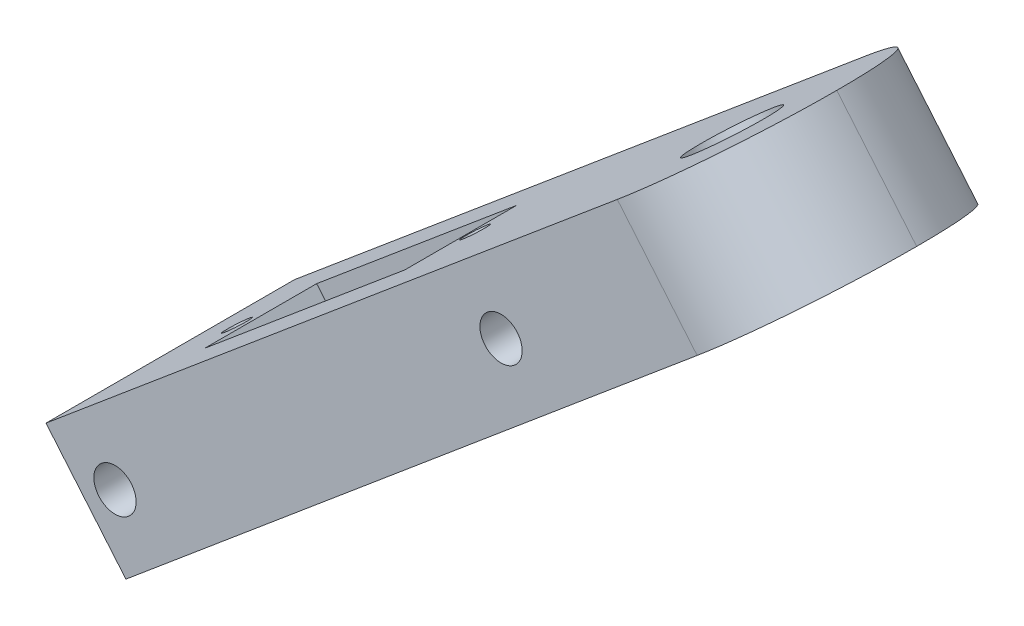
ISO-10303-21;
HEADER;
FILE_DESCRIPTION(('STEP AP214'),'2;1');
FILE_NAME('part.step','',(''),(''),'','','');
FILE_SCHEMA(('AUTOMOTIVE_DESIGN { 1 0 10303 214 1 1 1 1 }'));
ENDSEC;
DATA;
#1=APPLICATION_CONTEXT('core data for automotive mechanical design processes');
#2=APPLICATION_PROTOCOL_DEFINITION('international standard','automotive_design',2000,#1);
#3=PRODUCT_CONTEXT('',#1,'mechanical');
#4=PRODUCT('Part','Part','',(#3));
#5=PRODUCT_RELATED_PRODUCT_CATEGORY('part','',(#4));
#6=PRODUCT_DEFINITION_FORMATION('','',#4);
#7=PRODUCT_DEFINITION_CONTEXT('part definition',#1,'design');
#8=PRODUCT_DEFINITION('design','',#6,#7);
#9=PRODUCT_DEFINITION_SHAPE('','',#8);
#10=(LENGTH_UNIT() NAMED_UNIT(*) SI_UNIT(.MILLI.,.METRE.));
#11=(NAMED_UNIT(*) PLANE_ANGLE_UNIT() SI_UNIT($,.RADIAN.));
#12=(NAMED_UNIT(*) SI_UNIT($,.STERADIAN.) SOLID_ANGLE_UNIT());
#13=UNCERTAINTY_MEASURE_WITH_UNIT(LENGTH_MEASURE(1.E-05),#10,'distance_accuracy_value','');
#14=(GEOMETRIC_REPRESENTATION_CONTEXT(3) GLOBAL_UNCERTAINTY_ASSIGNED_CONTEXT((#13)) GLOBAL_UNIT_ASSIGNED_CONTEXT((#10,
#11,#12)) REPRESENTATION_CONTEXT('',''));
#15=CARTESIAN_POINT('',(0.,0.,0.));
#16=DIRECTION('',(0.,0.,1.));
#17=DIRECTION('',(1.,0.,0.));
#18=AXIS2_PLACEMENT_3D('',#15,#16,#17);
#19=CARTESIAN_POINT('',(-6.4278760968654,7.66044443118977,0.));
#20=DIRECTION('',(-0.64278760968654,0.766044443118977,0.));
#21=DIRECTION('',(-0.766044443118977,-0.64278760968654,0.));
#22=AXIS2_PLACEMENT_3D('',#19,#20,#21);
#23=PLANE('',#22);
#24=CARTESIAN_POINT('',(23.4478571847747,32.7291612089649,0.));
#25=DIRECTION('',(-0.64278760968654,0.766044443118977,0.));
#26=DIRECTION('',(-0.766044443118977,-0.642787609686541,0.));
#27=AXIS2_PLACEMENT_3D('',#24,#25,#26);
#28=CIRCLE('',#27,3.29999999999999);
#29=CARTESIAN_POINT('',(20.9199105224821,30.6079620969993,0.));
#30=VERTEX_POINT('',#29);
#31=EDGE_CURVE('E209',#30,#30,#28,.T.);
#32=ORIENTED_EDGE('',*,*,#31,.F.);
#33=EDGE_LOOP('',(#32));
#34=FACE_BOUND('',#33,.T.);
#35=CARTESIAN_POINT('',(-16.3864538574121,-0.695794494735249,0.));
#36=DIRECTION('',(-0.64278760968654,0.766044443118977,0.));
#37=DIRECTION('',(-0.766044443118977,-0.642787609686541,0.));
#38=AXIS2_PLACEMENT_3D('',#35,#36,#37);
#39=CIRCLE('',#38,0.999999999999998);
#40=CARTESIAN_POINT('',(-17.1524983005311,-1.33858210442179,0.));
#41=VERTEX_POINT('',#40);
#42=EDGE_CURVE('E215',#41,#41,#39,.T.);
#43=ORIENTED_EDGE('',*,*,#42,.F.);
#44=EDGE_LOOP('',(#43));
#45=FACE_BOUND('',#44,.T.);
#46=CARTESIAN_POINT('',(2.76465722056232,15.3738957474283,0.));
#47=DIRECTION('',(-0.64278760968654,0.766044443118977,0.));
#48=DIRECTION('',(-0.766044443118977,-0.642787609686541,0.));
#49=AXIS2_PLACEMENT_3D('',#46,#47,#48);
#50=CIRCLE('',#49,1.);
#51=CARTESIAN_POINT('',(1.99861277744334,14.7311081377417,0.));
#52=VERTEX_POINT('',#51);
#53=EDGE_CURVE('E221',#52,#52,#50,.T.);
#54=ORIENTED_EDGE('',*,*,#53,.F.);
#55=EDGE_LOOP('',(#54));
#56=FACE_BOUND('',#55,.T.);
#57=CARTESIAN_POINT('',(24.2139016278937,33.3719488186514,0.));
#58=DIRECTION('',(-0.64278760968654,0.766044443118977,0.));
#59=DIRECTION('',(-0.766044443118977,-0.64278760968654,0.));
#60=AXIS2_PLACEMENT_3D('',#57,#58,#59);
#61=CIRCLE('',#60,10.);
#62=CARTESIAN_POINT('',(24.2139016278937,33.3719488186514,10.));
#63=VERTEX_POINT('',#62);
#64=CARTESIAN_POINT('',(31.8743460590835,39.7998249155168,0.));
#65=VERTEX_POINT('',#64);
#66=EDGE_CURVE('E53',#63,#65,#61,.T.);
#67=ORIENTED_EDGE('',*,*,#66,.T.);
#68=CARTESIAN_POINT('',(24.2139016278937,33.3719488186514,0.));
#69=DIRECTION('',(-0.64278760968654,0.766044443118977,0.));
#70=DIRECTION('',(-0.766044443118977,-0.64278760968654,0.));
#71=AXIS2_PLACEMENT_3D('',#68,#69,#70);
#72=CIRCLE('',#71,10.);
#73=CARTESIAN_POINT('',(24.2139016278937,33.3719488186514,-10.));
#74=VERTEX_POINT('',#73);
#75=EDGE_CURVE('E46',#65,#74,#72,.T.);
#76=ORIENTED_EDGE('',*,*,#75,.T.);
#77=DIRECTION('',(-0.766044443118977,-0.64278760968654,0.));
#78=VECTOR('',#77,1.);
#79=CARTESIAN_POINT('',(-21.7487649592449,-5.19530776254104,-10.));
#80=LINE('',#79,#78);
#81=CARTESIAN_POINT('',(-21.7487649592449,-5.19530776254104,-10.));
#82=VERTEX_POINT('',#81);
#83=EDGE_CURVE('E158',#74,#82,#80,.T.);
#84=ORIENTED_EDGE('',*,*,#83,.T.);
#85=DIRECTION('',(0.,0.,1.));
#86=VECTOR('',#85,1.);
#87=CARTESIAN_POINT('',(-21.7487649592449,-5.19530776254104,-10.));
#88=LINE('',#87,#86);
#89=CARTESIAN_POINT('',(-21.7487649592449,-5.19530776254103,10.));
#90=VERTEX_POINT('',#89);
#91=EDGE_CURVE('E152',#82,#90,#88,.T.);
#92=ORIENTED_EDGE('',*,*,#91,.T.);
#93=DIRECTION('',(0.766044443118977,0.64278760968654,0.));
#94=VECTOR('',#93,1.);
#95=CARTESIAN_POINT('',(-21.7487649592449,-5.19530776254103,10.));
#96=LINE('',#95,#94);
#97=EDGE_CURVE('E155',#90,#63,#96,.T.);
#98=ORIENTED_EDGE('',*,*,#97,.T.);
#99=EDGE_LOOP('',(#67,#76,#84,#92,#98));
#100=FACE_BOUND('',#99,.T.);
#101=DIRECTION('',(0.766044443118977,0.642787609686541,0.));
#102=VECTOR('',#101,1.);
#103=CARTESIAN_POINT('',(1.61559055588379,14.4097143328984,4.49999999999997));
#104=LINE('',#103,#102);
#105=CARTESIAN_POINT('',(-14.4713427496147,0.911174529481098,4.49999999999997));
#106=VERTEX_POINT('',#105);
#107=CARTESIAN_POINT('',(1.61559055588379,14.4097143328984,4.49999999999997));
#108=VERTEX_POINT('',#107);
#109=EDGE_CURVE('E119',#106,#108,#104,.T.);
#110=ORIENTED_EDGE('',*,*,#109,.F.);
#111=DIRECTION('',(0.,0.,1.));
#112=VECTOR('',#111,1.);
#113=CARTESIAN_POINT('',(-14.4713427496147,0.911174529481098,-4.5));
#114=LINE('',#113,#112);
#115=CARTESIAN_POINT('',(-14.4713427496147,0.911174529481098,-4.5));
#116=VERTEX_POINT('',#115);
#117=EDGE_CURVE('E109',#116,#106,#114,.T.);
#118=ORIENTED_EDGE('',*,*,#117,.F.);
#119=DIRECTION('',(-0.766044443118977,-0.642787609686541,0.));
#120=VECTOR('',#119,1.);
#121=CARTESIAN_POINT('',(1.61559055588379,14.4097143328984,-4.5));
#122=LINE('',#121,#120);
#123=CARTESIAN_POINT('',(1.61559055588379,14.4097143328984,-4.5));
#124=VERTEX_POINT('',#123);
#125=EDGE_CURVE('E134',#124,#116,#122,.T.);
#126=ORIENTED_EDGE('',*,*,#125,.F.);
#127=DIRECTION('',(0.,0.,-1.));
#128=VECTOR('',#127,1.);
#129=CARTESIAN_POINT('',(1.61559055588379,14.4097143328984,-4.5));
#130=LINE('',#129,#128);
#131=EDGE_CURVE('E132',#108,#124,#130,.T.);
#132=ORIENTED_EDGE('',*,*,#131,.F.);
#133=EDGE_LOOP('',(#110,#118,#126,#132));
#134=FACE_BOUND('',#133,.T.);
#135=ADVANCED_FACE('F37',(#34,#45,#56,#100,#134),#23,.T.);
#136=CARTESIAN_POINT('',(0.,0.,0.));
#137=DIRECTION('',(-0.64278760968654,0.766044443118977,0.));
#138=DIRECTION('',(-0.766044443118977,-0.64278760968654,0.));
#139=AXIS2_PLACEMENT_3D('',#136,#137,#138);
#140=PLANE('',#139);
#141=CARTESIAN_POINT('',(29.8757332816401,25.0687167777751,0.));
#142=DIRECTION('',(-0.64278760968654,0.766044443118977,0.));
#143=DIRECTION('',(-0.766044443118977,-0.64278760968654,0.));
#144=AXIS2_PLACEMENT_3D('',#141,#142,#143);
#145=CIRCLE('',#144,3.29999999999999);
#146=CARTESIAN_POINT('',(27.3477866193475,22.9475176658095,0.));
#147=VERTEX_POINT('',#146);
#148=EDGE_CURVE('E141',#147,#147,#145,.F.);
#149=ORIENTED_EDGE('',*,*,#148,.F.);
#150=EDGE_LOOP('',(#149));
#151=FACE_BOUND('',#150,.T.);
#152=CARTESIAN_POINT('',(-9.9585777605467,-8.35623892592503,0.));
#153=DIRECTION('',(-0.64278760968654,0.766044443118977,0.));
#154=DIRECTION('',(-0.766044443118977,-0.64278760968654,0.));
#155=AXIS2_PLACEMENT_3D('',#152,#153,#154);
#156=CIRCLE('',#155,0.999999999999998);
#157=CARTESIAN_POINT('',(-10.7246222036657,-8.99902653561157,0.));
#158=VERTEX_POINT('',#157);
#159=EDGE_CURVE('E212',#158,#158,#156,.F.);
#160=ORIENTED_EDGE('',*,*,#159,.F.);
#161=EDGE_LOOP('',(#160));
#162=FACE_BOUND('',#161,.T.);
#163=CARTESIAN_POINT('',(9.19253331742773,7.71345131623848,0.));
#164=DIRECTION('',(-0.64278760968654,0.766044443118977,0.));
#165=DIRECTION('',(-0.766044443118977,-0.64278760968654,0.));
#166=AXIS2_PLACEMENT_3D('',#163,#164,#165);
#167=CIRCLE('',#166,1.);
#168=CARTESIAN_POINT('',(8.42648887430875,7.07066370655194,0.));
#169=VERTEX_POINT('',#168);
#170=EDGE_CURVE('E218',#169,#169,#167,.F.);
#171=ORIENTED_EDGE('',*,*,#170,.F.);
#172=EDGE_LOOP('',(#171));
#173=FACE_BOUND('',#172,.T.);
#174=DIRECTION('',(-0.766044443118977,-0.64278760968654,0.));
#175=VECTOR('',#174,1.);
#176=CARTESIAN_POINT('',(-15.3208888623795,-12.8557521937308,-10.));
#177=LINE('',#176,#175);
#178=CARTESIAN_POINT('',(30.6417777247591,25.7115043874616,-10.));
#179=VERTEX_POINT('',#178);
#180=CARTESIAN_POINT('',(-15.3208888623795,-12.8557521937308,-10.));
#181=VERTEX_POINT('',#180);
#182=EDGE_CURVE('E156',#179,#181,#177,.T.);
#183=ORIENTED_EDGE('',*,*,#182,.F.);
#184=CARTESIAN_POINT('',(30.6417777247591,25.7115043874616,0.));
#185=DIRECTION('',(-0.64278760968654,0.766044443118977,0.));
#186=DIRECTION('',(-0.766044443118977,-0.64278760968654,0.));
#187=AXIS2_PLACEMENT_3D('',#184,#185,#186);
#188=CIRCLE('',#187,10.);
#189=CARTESIAN_POINT('',(38.3022221559489,32.139380484327,0.));
#190=VERTEX_POINT('',#189);
#191=EDGE_CURVE('E176',#179,#190,#188,.F.);
#192=ORIENTED_EDGE('',*,*,#191,.T.);
#193=CARTESIAN_POINT('',(30.6417777247591,25.7115043874616,0.));
#194=DIRECTION('',(-0.64278760968654,0.766044443118977,0.));
#195=DIRECTION('',(-0.766044443118977,-0.64278760968654,0.));
#196=AXIS2_PLACEMENT_3D('',#193,#194,#195);
#197=CIRCLE('',#196,10.);
#198=CARTESIAN_POINT('',(30.6417777247591,25.7115043874616,10.));
#199=VERTEX_POINT('',#198);
#200=EDGE_CURVE('E174',#190,#199,#197,.F.);
#201=ORIENTED_EDGE('',*,*,#200,.T.);
#202=DIRECTION('',(0.766044443118977,0.64278760968654,0.));
#203=VECTOR('',#202,1.);
#204=CARTESIAN_POINT('',(-15.3208888623795,-12.8557521937308,10.));
#205=LINE('',#204,#203);
#206=CARTESIAN_POINT('',(-15.3208888623795,-12.8557521937308,10.));
#207=VERTEX_POINT('',#206);
#208=EDGE_CURVE('E163',#207,#199,#205,.T.);
#209=ORIENTED_EDGE('',*,*,#208,.F.);
#210=DIRECTION('',(0.,0.,1.));
#211=VECTOR('',#210,1.);
#212=CARTESIAN_POINT('',(-15.3208888623795,-12.8557521937308,-10.));
#213=LINE('',#212,#211);
#214=EDGE_CURVE('E127',#181,#207,#213,.T.);
#215=ORIENTED_EDGE('',*,*,#214,.F.);
#216=EDGE_LOOP('',(#183,#192,#201,#209,#215));
#217=FACE_BOUND('',#216,.T.);
#218=DIRECTION('',(0.,0.,1.));
#219=VECTOR('',#218,1.);
#220=CARTESIAN_POINT('',(-8.04346665274926,-6.74926990170867,-4.5));
#221=LINE('',#220,#219);
#222=CARTESIAN_POINT('',(-8.04346665274926,-6.74926990170867,-4.5));
#223=VERTEX_POINT('',#222);
#224=CARTESIAN_POINT('',(-8.04346665274926,-6.74926990170867,4.49999999999997));
#225=VERTEX_POINT('',#224);
#226=EDGE_CURVE('E139',#223,#225,#221,.T.);
#227=ORIENTED_EDGE('',*,*,#226,.T.);
#228=DIRECTION('',(0.766044443118977,0.642787609686541,0.));
#229=VECTOR('',#228,1.);
#230=CARTESIAN_POINT('',(8.04346665274919,6.74926990170862,4.49999999999997));
#231=LINE('',#230,#229);
#232=CARTESIAN_POINT('',(8.04346665274919,6.74926990170862,4.49999999999997));
#233=VERTEX_POINT('',#232);
#234=EDGE_CURVE('E126',#225,#233,#231,.T.);
#235=ORIENTED_EDGE('',*,*,#234,.T.);
#236=DIRECTION('',(0.,0.,-1.));
#237=VECTOR('',#236,1.);
#238=CARTESIAN_POINT('',(8.04346665274919,6.74926990170862,-4.5));
#239=LINE('',#238,#237);
#240=CARTESIAN_POINT('',(8.04346665274919,6.74926990170862,-4.5));
#241=VERTEX_POINT('',#240);
#242=EDGE_CURVE('E143',#233,#241,#239,.T.);
#243=ORIENTED_EDGE('',*,*,#242,.T.);
#244=DIRECTION('',(-0.766044443118977,-0.642787609686541,0.));
#245=VECTOR('',#244,1.);
#246=CARTESIAN_POINT('',(8.04346665274919,6.74926990170862,-4.5));
#247=LINE('',#246,#245);
#248=EDGE_CURVE('E120',#241,#223,#247,.T.);
#249=ORIENTED_EDGE('',*,*,#248,.T.);
#250=EDGE_LOOP('',(#227,#235,#243,#249));
#251=FACE_BOUND('',#250,.T.);
#252=ADVANCED_FACE('F192',(#151,#162,#173,#217,#251),#140,.F.);
#253=CARTESIAN_POINT('',(-21.7487649592449,-5.19530776254104,-10.));
#254=DIRECTION('',(0.766044443118977,0.642787609686541,0.));
#255=DIRECTION('',(-0.642787609686541,0.766044443118977,0.));
#256=AXIS2_PLACEMENT_3D('',#253,#254,#255);
#257=PLANE('',#256);
#258=ORIENTED_EDGE('',*,*,#214,.T.);
#259=DIRECTION('',(0.642787609686541,-0.766044443118977,0.));
#260=VECTOR('',#259,1.);
#261=CARTESIAN_POINT('',(-21.7487649592449,-5.19530776254103,10.));
#262=LINE('',#261,#260);
#263=EDGE_CURVE('E168',#90,#207,#262,.T.);
#264=ORIENTED_EDGE('',*,*,#263,.F.);
#265=ORIENTED_EDGE('',*,*,#91,.F.);
#266=DIRECTION('',(0.642787609686541,-0.766044443118977,0.));
#267=VECTOR('',#266,1.);
#268=CARTESIAN_POINT('',(-21.7487649592449,-5.19530776254104,-10.));
#269=LINE('',#268,#267);
#270=EDGE_CURVE('E160',#82,#181,#269,.T.);
#271=ORIENTED_EDGE('',*,*,#270,.T.);
#272=EDGE_LOOP('',(#258,#264,#265,#271));
#273=FACE_BOUND('',#272,.T.);
#274=ADVANCED_FACE('F229',(#273),#257,.F.);
#275=CARTESIAN_POINT('',(-21.7487649592449,-5.19530776254103,10.));
#276=DIRECTION('',(0.,0.,-1.));
#277=DIRECTION('',(-1.,0.,0.));
#278=AXIS2_PLACEMENT_3D('',#275,#276,#277);
#279=PLANE('',#278);
#280=CARTESIAN_POINT('',(-16.1982186682855,-7.06488286362593,10.));
#281=DIRECTION('',(0.,0.,1.));
#282=DIRECTION('',(1.,0.,0.));
#283=AXIS2_PLACEMENT_3D('',#280,#281,#282);
#284=CIRCLE('',#283,1.7);
#285=CARTESIAN_POINT('',(-14.4982186682855,-7.06488286362593,10.));
#286=VERTEX_POINT('',#285);
#287=EDGE_CURVE('E203',#286,#286,#284,.T.);
#288=ORIENTED_EDGE('',*,*,#287,.F.);
#289=EDGE_LOOP('',(#288));
#290=FACE_BOUND('',#289,.T.);
#291=CARTESIAN_POINT('',(14.8626492956688,18.9982799889744,10.));
#292=DIRECTION('',(0.,0.,1.));
#293=DIRECTION('',(1.,0.,0.));
#294=AXIS2_PLACEMENT_3D('',#291,#292,#293);
#295=CIRCLE('',#294,1.7);
#296=CARTESIAN_POINT('',(16.5626492956688,18.9982799889744,10.));
#297=VERTEX_POINT('',#296);
#298=EDGE_CURVE('E196',#297,#297,#295,.T.);
#299=ORIENTED_EDGE('',*,*,#298,.F.);
#300=EDGE_LOOP('',(#299));
#301=FACE_BOUND('',#300,.T.);
#302=ORIENTED_EDGE('',*,*,#208,.T.);
#303=DIRECTION('',(0.642787609686541,-0.766044443118977,0.));
#304=VECTOR('',#303,1.);
#305=CARTESIAN_POINT('',(24.2139016278937,33.3719488186514,10.));
#306=LINE('',#305,#304);
#307=EDGE_CURVE('E11',#199,#63,#306,.F.);
#308=ORIENTED_EDGE('',*,*,#307,.T.);
#309=ORIENTED_EDGE('',*,*,#97,.F.);
#310=ORIENTED_EDGE('',*,*,#263,.T.);
#311=EDGE_LOOP('',(#302,#308,#309,#310));
#312=FACE_BOUND('',#311,.T.);
#313=ADVANCED_FACE('F236',(#290,#301,#312),#279,.F.);
#314=CARTESIAN_POINT('',(-21.7487649592449,-5.19530776254104,-10.));
#315=DIRECTION('',(0.,0.,1.));
#316=DIRECTION('',(1.,0.,0.));
#317=AXIS2_PLACEMENT_3D('',#314,#315,#316);
#318=PLANE('',#317);
#319=CARTESIAN_POINT('',(-16.1982186682855,-7.06488286362593,-10.));
#320=DIRECTION('',(0.,0.,1.));
#321=DIRECTION('',(1.,0.,0.));
#322=AXIS2_PLACEMENT_3D('',#319,#320,#321);
#323=CIRCLE('',#322,1.7);
#324=CARTESIAN_POINT('',(-14.4982186682855,-7.06488286362593,-10.));
#325=VERTEX_POINT('',#324);
#326=EDGE_CURVE('E206',#325,#325,#323,.F.);
#327=ORIENTED_EDGE('',*,*,#326,.F.);
#328=EDGE_LOOP('',(#327));
#329=FACE_BOUND('',#328,.T.);
#330=CARTESIAN_POINT('',(14.8626492956688,18.9982799889744,-10.));
#331=DIRECTION('',(0.,0.,1.));
#332=DIRECTION('',(1.,0.,0.));
#333=AXIS2_PLACEMENT_3D('',#330,#331,#332);
#334=CIRCLE('',#333,1.7);
#335=CARTESIAN_POINT('',(16.5626492956688,18.9982799889744,-10.));
#336=VERTEX_POINT('',#335);
#337=EDGE_CURVE('E198',#336,#336,#334,.F.);
#338=ORIENTED_EDGE('',*,*,#337,.F.);
#339=EDGE_LOOP('',(#338));
#340=FACE_BOUND('',#339,.T.);
#341=ORIENTED_EDGE('',*,*,#83,.F.);
#342=DIRECTION('',(0.642787609686541,-0.766044443118977,0.));
#343=VECTOR('',#342,1.);
#344=CARTESIAN_POINT('',(24.2139016278937,33.3719488186514,-10.));
#345=LINE('',#344,#343);
#346=EDGE_CURVE('E171',#74,#179,#345,.T.);
#347=ORIENTED_EDGE('',*,*,#346,.T.);
#348=ORIENTED_EDGE('',*,*,#182,.T.);
#349=ORIENTED_EDGE('',*,*,#270,.F.);
#350=EDGE_LOOP('',(#341,#347,#348,#349));
#351=FACE_BOUND('',#350,.T.);
#352=ADVANCED_FACE('F186',(#329,#340,#351),#318,.F.);
#353=CARTESIAN_POINT('',(-14.4713427496147,0.911174529481098,-4.5));
#354=DIRECTION('',(0.766044443118977,0.642787609686541,0.));
#355=DIRECTION('',(-0.642787609686541,0.766044443118977,0.));
#356=AXIS2_PLACEMENT_3D('',#353,#354,#355);
#357=PLANE('',#356);
#358=ORIENTED_EDGE('',*,*,#226,.F.);
#359=DIRECTION('',(0.642787609686541,-0.766044443118977,0.));
#360=VECTOR('',#359,1.);
#361=CARTESIAN_POINT('',(-14.4713427496147,0.911174529481098,-4.5));
#362=LINE('',#361,#360);
#363=EDGE_CURVE('E115',#116,#223,#362,.T.);
#364=ORIENTED_EDGE('',*,*,#363,.F.);
#365=ORIENTED_EDGE('',*,*,#117,.T.);
#366=DIRECTION('',(0.642787609686541,-0.766044443118977,0.));
#367=VECTOR('',#366,1.);
#368=CARTESIAN_POINT('',(-14.4713427496147,0.911174529481098,4.49999999999997));
#369=LINE('',#368,#367);
#370=EDGE_CURVE('E112',#106,#225,#369,.T.);
#371=ORIENTED_EDGE('',*,*,#370,.T.);
#372=EDGE_LOOP('',(#358,#364,#365,#371));
#373=FACE_BOUND('',#372,.T.);
#374=ADVANCED_FACE('F111',(#373),#357,.T.);
#375=CARTESIAN_POINT('',(1.61559055588379,14.4097143328984,4.49999999999997));
#376=DIRECTION('',(0.,0.,-1.));
#377=DIRECTION('',(-1.,0.,0.));
#378=AXIS2_PLACEMENT_3D('',#375,#376,#377);
#379=PLANE('',#378);
#380=ORIENTED_EDGE('',*,*,#234,.F.);
#381=ORIENTED_EDGE('',*,*,#370,.F.);
#382=ORIENTED_EDGE('',*,*,#109,.T.);
#383=DIRECTION('',(0.642787609686541,-0.766044443118977,0.));
#384=VECTOR('',#383,1.);
#385=CARTESIAN_POINT('',(1.61559055588379,14.4097143328984,4.49999999999997));
#386=LINE('',#385,#384);
#387=EDGE_CURVE('E128',#108,#233,#386,.T.);
#388=ORIENTED_EDGE('',*,*,#387,.T.);
#389=EDGE_LOOP('',(#380,#381,#382,#388));
#390=FACE_BOUND('',#389,.T.);
#391=ADVANCED_FACE('F123',(#390),#379,.T.);
#392=CARTESIAN_POINT('',(1.61559055588379,14.4097143328984,-4.5));
#393=DIRECTION('',(-0.766044443118977,-0.642787609686541,0.));
#394=DIRECTION('',(0.642787609686541,-0.766044443118977,0.));
#395=AXIS2_PLACEMENT_3D('',#392,#393,#394);
#396=PLANE('',#395);
#397=ORIENTED_EDGE('',*,*,#242,.F.);
#398=ORIENTED_EDGE('',*,*,#387,.F.);
#399=ORIENTED_EDGE('',*,*,#131,.T.);
#400=DIRECTION('',(0.642787609686541,-0.766044443118977,0.));
#401=VECTOR('',#400,1.);
#402=CARTESIAN_POINT('',(1.61559055588379,14.4097143328984,-4.5));
#403=LINE('',#402,#401);
#404=EDGE_CURVE('E149',#124,#241,#403,.T.);
#405=ORIENTED_EDGE('',*,*,#404,.T.);
#406=EDGE_LOOP('',(#397,#398,#399,#405));
#407=FACE_BOUND('',#406,.T.);
#408=ADVANCED_FACE('F282',(#407),#396,.T.);
#409=CARTESIAN_POINT('',(1.61559055588379,14.4097143328984,-4.5));
#410=DIRECTION('',(0.,0.,1.));
#411=DIRECTION('',(1.,0.,0.));
#412=AXIS2_PLACEMENT_3D('',#409,#410,#411);
#413=PLANE('',#412);
#414=ORIENTED_EDGE('',*,*,#248,.F.);
#415=ORIENTED_EDGE('',*,*,#404,.F.);
#416=ORIENTED_EDGE('',*,*,#125,.T.);
#417=ORIENTED_EDGE('',*,*,#363,.T.);
#418=EDGE_LOOP('',(#414,#415,#416,#417));
#419=FACE_BOUND('',#418,.T.);
#420=ADVANCED_FACE('F278',(#419),#413,.T.);
#421=CARTESIAN_POINT('',(31.3492166517976,-18.6918556474689,0.));
#422=DIRECTION('',(-0.642787609686541,0.766044443118977,0.));
#423=DIRECTION('',(-0.766044443118977,-0.642787609686541,0.));
#424=AXIS2_PLACEMENT_3D('',#421,#422,#423);
#425=CYLINDRICAL_SURFACE('',#424,1.);
#426=ORIENTED_EDGE('',*,*,#53,.T.);
#427=EDGE_LOOP('',(#426));
#428=FACE_BOUND('',#427,.T.);
#429=ORIENTED_EDGE('',*,*,#170,.T.);
#430=EDGE_LOOP('',(#429));
#431=FACE_BOUND('',#430,.T.);
#432=ADVANCED_FACE('F226',(#428,#431),#425,.F.);
#433=CARTESIAN_POINT('',(12.1981055738231,-34.7615458896325,0.));
#434=DIRECTION('',(-0.642787609686541,0.766044443118977,0.));
#435=DIRECTION('',(-0.766044443118977,-0.642787609686541,0.));
#436=AXIS2_PLACEMENT_3D('',#433,#434,#435);
#437=CYLINDRICAL_SURFACE('',#436,0.999999999999998);
#438=ORIENTED_EDGE('',*,*,#42,.T.);
#439=EDGE_LOOP('',(#438));
#440=FACE_BOUND('',#439,.T.);
#441=ORIENTED_EDGE('',*,*,#159,.T.);
#442=EDGE_LOOP('',(#441));
#443=FACE_BOUND('',#442,.T.);
#444=ADVANCED_FACE('F271',(#440,#443),#437,.F.);
#445=CARTESIAN_POINT('',(52.0324166160099,-1.33659018593235,0.));
#446=DIRECTION('',(-0.642787609686541,0.766044443118977,0.));
#447=DIRECTION('',(-0.766044443118977,-0.642787609686541,0.));
#448=AXIS2_PLACEMENT_3D('',#445,#446,#447);
#449=CYLINDRICAL_SURFACE('',#448,3.29999999999999);
#450=ORIENTED_EDGE('',*,*,#31,.T.);
#451=EDGE_LOOP('',(#450));
#452=FACE_BOUND('',#451,.T.);
#453=ORIENTED_EDGE('',*,*,#148,.T.);
#454=EDGE_LOOP('',(#453));
#455=FACE_BOUND('',#454,.T.);
#456=ADVANCED_FACE('F264',(#452,#455),#449,.F.);
#457=CARTESIAN_POINT('',(14.8626492956688,18.9982799889744,-10.001));
#458=DIRECTION('',(0.,0.,1.));
#459=DIRECTION('',(1.,0.,0.));
#460=AXIS2_PLACEMENT_3D('',#457,#458,#459);
#461=CYLINDRICAL_SURFACE('',#460,1.7);
#462=ORIENTED_EDGE('',*,*,#298,.T.);
#463=EDGE_LOOP('',(#462));
#464=FACE_BOUND('',#463,.T.);
#465=ORIENTED_EDGE('',*,*,#337,.T.);
#466=EDGE_LOOP('',(#465));
#467=FACE_BOUND('',#466,.T.);
#468=ADVANCED_FACE('F258',(#464,#467),#461,.F.);
#469=CARTESIAN_POINT('',(-16.1982186682855,-7.06488286362593,-10.001));
#470=DIRECTION('',(0.,0.,1.));
#471=DIRECTION('',(1.,0.,0.));
#472=AXIS2_PLACEMENT_3D('',#469,#470,#471);
#473=CYLINDRICAL_SURFACE('',#472,1.7);
#474=ORIENTED_EDGE('',*,*,#287,.T.);
#475=EDGE_LOOP('',(#474));
#476=FACE_BOUND('',#475,.T.);
#477=ORIENTED_EDGE('',*,*,#326,.T.);
#478=EDGE_LOOP('',(#477));
#479=FACE_BOUND('',#478,.T.);
#480=ADVANCED_FACE('F254',(#476,#479),#473,.F.);
#481=CARTESIAN_POINT('',(24.2139016278937,33.3719488186514,0.));
#482=DIRECTION('',(0.642787609686541,-0.766044443118977,0.));
#483=DIRECTION('',(0.766044443118977,0.642787609686541,0.));
#484=AXIS2_PLACEMENT_3D('',#481,#482,#483);
#485=CYLINDRICAL_SURFACE('',#484,10.);
#486=DIRECTION('',(0.642787609686541,-0.766044443118977,0.));
#487=VECTOR('',#486,1.);
#488=CARTESIAN_POINT('',(31.8743460590835,39.7998249155168,0.));
#489=LINE('',#488,#487);
#490=EDGE_CURVE('E41',#65,#190,#489,.T.);
#491=ORIENTED_EDGE('',*,*,#490,.F.);
#492=ORIENTED_EDGE('',*,*,#66,.F.);
#493=ORIENTED_EDGE('',*,*,#307,.F.);
#494=ORIENTED_EDGE('',*,*,#200,.F.);
#495=EDGE_LOOP('',(#491,#492,#493,#494));
#496=FACE_BOUND('',#495,.T.);
#497=ADVANCED_FACE('F39',(#496),#485,.T.);
#498=CARTESIAN_POINT('',(24.2139016278937,33.3719488186514,0.));
#499=DIRECTION('',(0.642787609686541,-0.766044443118977,0.));
#500=DIRECTION('',(0.766044443118977,0.642787609686541,0.));
#501=AXIS2_PLACEMENT_3D('',#498,#499,#500);
#502=CYLINDRICAL_SURFACE('',#501,10.);
#503=ORIENTED_EDGE('',*,*,#75,.F.);
#504=ORIENTED_EDGE('',*,*,#490,.T.);
#505=ORIENTED_EDGE('',*,*,#191,.F.);
#506=ORIENTED_EDGE('',*,*,#346,.F.);
#507=EDGE_LOOP('',(#503,#504,#505,#506));
#508=FACE_BOUND('',#507,.T.);
#509=ADVANCED_FACE('F189',(#508),#502,.T.);
#510=CLOSED_SHELL('',(#135,#252,#274,#313,#352,#374,#391,#408,#420,#432,#444,#456,#468,#480,
#497,#509));
#511=MANIFOLD_SOLID_BREP('B2',#510);
#512=ADVANCED_BREP_SHAPE_REPRESENTATION('',(#18,#511),#14);
#513=SHAPE_DEFINITION_REPRESENTATION(#9,#512);
ENDSEC;
END-ISO-10303-21;
